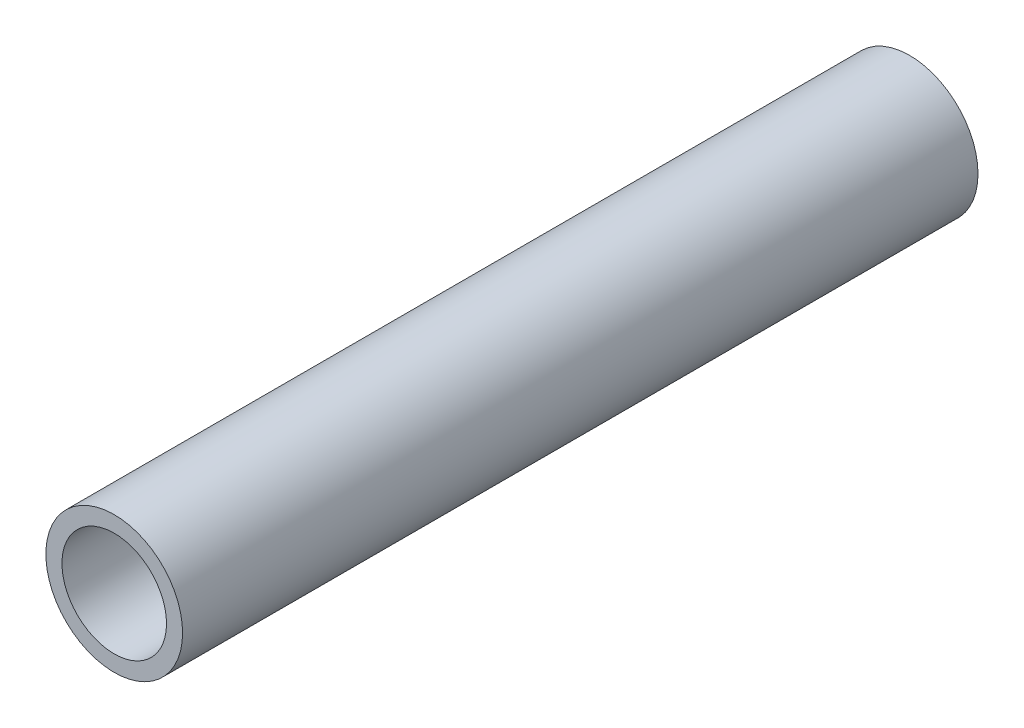
ISO-10303-21;
HEADER;
FILE_DESCRIPTION(('STEP AP214'),'2;1');
FILE_NAME('part.step','',(''),(''),'','','');
FILE_SCHEMA(('AUTOMOTIVE_DESIGN { 1 0 10303 214 1 1 1 1 }'));
ENDSEC;
DATA;
#1=APPLICATION_CONTEXT('core data for automotive mechanical design processes');
#2=APPLICATION_PROTOCOL_DEFINITION('international standard','automotive_design',2000,#1);
#3=PRODUCT_CONTEXT('',#1,'mechanical');
#4=PRODUCT('Part','Part','',(#3));
#5=PRODUCT_RELATED_PRODUCT_CATEGORY('part','',(#4));
#6=PRODUCT_DEFINITION_FORMATION('','',#4);
#7=PRODUCT_DEFINITION_CONTEXT('part definition',#1,'design');
#8=PRODUCT_DEFINITION('design','',#6,#7);
#9=PRODUCT_DEFINITION_SHAPE('','',#8);
#10=(LENGTH_UNIT() NAMED_UNIT(*) SI_UNIT(.MILLI.,.METRE.));
#11=(NAMED_UNIT(*) PLANE_ANGLE_UNIT() SI_UNIT($,.RADIAN.));
#12=(NAMED_UNIT(*) SI_UNIT($,.STERADIAN.) SOLID_ANGLE_UNIT());
#13=UNCERTAINTY_MEASURE_WITH_UNIT(LENGTH_MEASURE(1.E-05),#10,'distance_accuracy_value','');
#14=(GEOMETRIC_REPRESENTATION_CONTEXT(3) GLOBAL_UNCERTAINTY_ASSIGNED_CONTEXT((#13)) GLOBAL_UNIT_ASSIGNED_CONTEXT((#10,
#11,#12)) REPRESENTATION_CONTEXT('',''));
#15=CARTESIAN_POINT('',(0.,0.,0.));
#16=DIRECTION('',(0.,0.,1.));
#17=DIRECTION('',(1.,0.,0.));
#18=AXIS2_PLACEMENT_3D('',#15,#16,#17);
#19=CARTESIAN_POINT('',(0.,0.,49.45));
#20=DIRECTION('',(0.,0.,1.));
#21=DIRECTION('',(1.,0.,0.));
#22=AXIS2_PLACEMENT_3D('',#19,#20,#21);
#23=PLANE('',#22);
#24=CARTESIAN_POINT('',(0.,0.,49.45));
#25=DIRECTION('',(0.,0.,1.));
#26=DIRECTION('',(1.,0.,0.));
#27=AXIS2_PLACEMENT_3D('',#24,#25,#26);
#28=CIRCLE('',#27,4.25);
#29=CARTESIAN_POINT('',(4.25,0.,49.45));
#30=VERTEX_POINT('',#29);
#31=EDGE_CURVE('E10',#30,#30,#28,.T.);
#32=ORIENTED_EDGE('',*,*,#31,.T.);
#33=EDGE_LOOP('',(#32));
#34=FACE_BOUND('',#33,.T.);
#35=CARTESIAN_POINT('',(0.,0.,49.45));
#36=DIRECTION('',(0.,0.,1.));
#37=DIRECTION('',(1.,0.,0.));
#38=AXIS2_PLACEMENT_3D('',#35,#36,#37);
#39=CIRCLE('',#38,3.25);
#40=CARTESIAN_POINT('',(3.25,0.,49.45));
#41=VERTEX_POINT('',#40);
#42=EDGE_CURVE('E42',#41,#41,#39,.T.);
#43=ORIENTED_EDGE('',*,*,#42,.F.);
#44=EDGE_LOOP('',(#43));
#45=FACE_BOUND('',#44,.T.);
#46=ADVANCED_FACE('F31',(#34,#45),#23,.T.);
#47=CARTESIAN_POINT('',(0.,0.,0.));
#48=DIRECTION('',(0.,0.,1.));
#49=DIRECTION('',(1.,0.,0.));
#50=AXIS2_PLACEMENT_3D('',#47,#48,#49);
#51=PLANE('',#50);
#52=CARTESIAN_POINT('',(0.,0.,0.));
#53=DIRECTION('',(0.,0.,1.));
#54=DIRECTION('',(1.,0.,0.));
#55=AXIS2_PLACEMENT_3D('',#52,#53,#54);
#56=CIRCLE('',#55,4.25);
#57=CARTESIAN_POINT('',(4.25,0.,0.));
#58=VERTEX_POINT('',#57);
#59=EDGE_CURVE('E35',#58,#58,#56,.T.);
#60=ORIENTED_EDGE('',*,*,#59,.F.);
#61=EDGE_LOOP('',(#60));
#62=FACE_BOUND('',#61,.T.);
#63=CARTESIAN_POINT('',(0.,0.,0.));
#64=DIRECTION('',(0.,0.,1.));
#65=DIRECTION('',(1.,0.,0.));
#66=AXIS2_PLACEMENT_3D('',#63,#64,#65);
#67=CIRCLE('',#66,3.25);
#68=CARTESIAN_POINT('',(3.25,0.,0.));
#69=VERTEX_POINT('',#68);
#70=EDGE_CURVE('E44',#69,#69,#67,.T.);
#71=ORIENTED_EDGE('',*,*,#70,.T.);
#72=EDGE_LOOP('',(#71));
#73=FACE_BOUND('',#72,.T.);
#74=ADVANCED_FACE('F54',(#62,#73),#51,.F.);
#75=CARTESIAN_POINT('',(0.,0.,49.45));
#76=DIRECTION('',(0.,0.,-1.));
#77=DIRECTION('',(-1.,0.,0.));
#78=AXIS2_PLACEMENT_3D('',#75,#76,#77);
#79=CYLINDRICAL_SURFACE('',#78,4.25);
#80=ORIENTED_EDGE('',*,*,#31,.F.);
#81=EDGE_LOOP('',(#80));
#82=FACE_BOUND('',#81,.T.);
#83=ORIENTED_EDGE('',*,*,#59,.T.);
#84=EDGE_LOOP('',(#83));
#85=FACE_BOUND('',#84,.T.);
#86=ADVANCED_FACE('F33',(#82,#85),#79,.T.);
#87=CARTESIAN_POINT('',(0.,0.,49.45));
#88=DIRECTION('',(0.,0.,-1.));
#89=DIRECTION('',(-1.,0.,0.));
#90=AXIS2_PLACEMENT_3D('',#87,#88,#89);
#91=CYLINDRICAL_SURFACE('',#90,3.25);
#92=ORIENTED_EDGE('',*,*,#42,.T.);
#93=EDGE_LOOP('',(#92));
#94=FACE_BOUND('',#93,.T.);
#95=ORIENTED_EDGE('',*,*,#70,.F.);
#96=EDGE_LOOP('',(#95));
#97=FACE_BOUND('',#96,.T.);
#98=ADVANCED_FACE('F50',(#94,#97),#91,.F.);
#99=CLOSED_SHELL('',(#46,#74,#86,#98));
#100=MANIFOLD_SOLID_BREP('B2',#99);
#101=ADVANCED_BREP_SHAPE_REPRESENTATION('',(#18,#100),#14);
#102=SHAPE_DEFINITION_REPRESENTATION(#9,#101);
ENDSEC;
END-ISO-10303-21;
